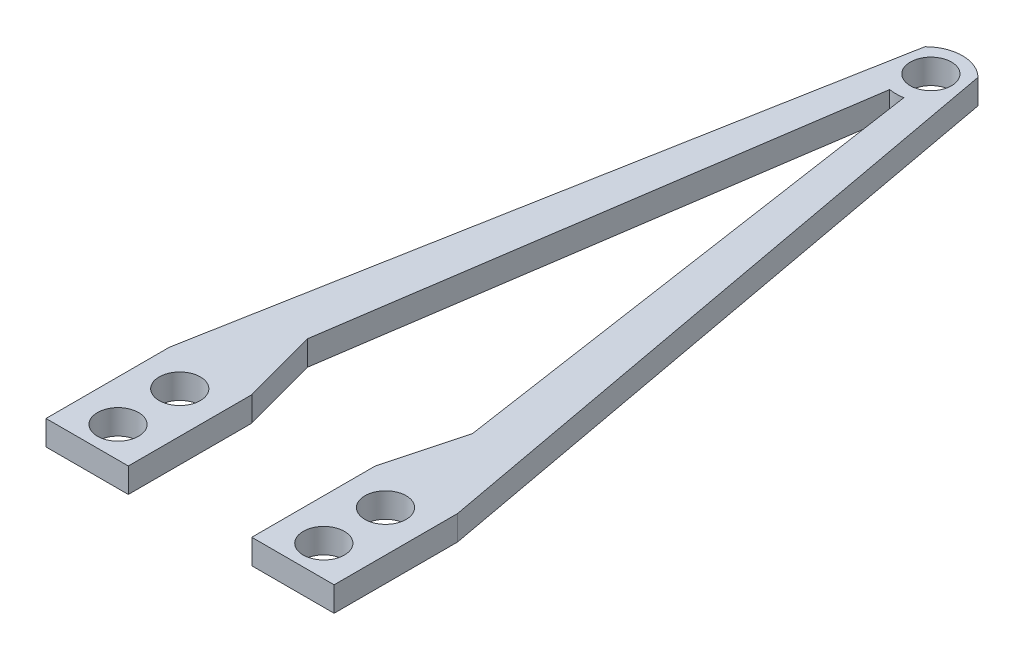
ISO-10303-21;
HEADER;
FILE_DESCRIPTION(('STEP AP214'),'2;1');
FILE_NAME('part.step','',(''),(''),'','','');
FILE_SCHEMA(('AUTOMOTIVE_DESIGN { 1 0 10303 214 1 1 1 1 }'));
ENDSEC;
DATA;
#1=APPLICATION_CONTEXT('core data for automotive mechanical design processes');
#2=APPLICATION_PROTOCOL_DEFINITION('international standard','automotive_design',2000,#1);
#3=PRODUCT_CONTEXT('',#1,'mechanical');
#4=PRODUCT('Part','Part','',(#3));
#5=PRODUCT_RELATED_PRODUCT_CATEGORY('part','',(#4));
#6=PRODUCT_DEFINITION_FORMATION('','',#4);
#7=PRODUCT_DEFINITION_CONTEXT('part definition',#1,'design');
#8=PRODUCT_DEFINITION('design','',#6,#7);
#9=PRODUCT_DEFINITION_SHAPE('','',#8);
#10=(LENGTH_UNIT() NAMED_UNIT(*) SI_UNIT(.MILLI.,.METRE.));
#11=(NAMED_UNIT(*) PLANE_ANGLE_UNIT() SI_UNIT($,.RADIAN.));
#12=(NAMED_UNIT(*) SI_UNIT($,.STERADIAN.) SOLID_ANGLE_UNIT());
#13=UNCERTAINTY_MEASURE_WITH_UNIT(LENGTH_MEASURE(1.E-05),#10,'distance_accuracy_value','');
#14=(GEOMETRIC_REPRESENTATION_CONTEXT(3) GLOBAL_UNCERTAINTY_ASSIGNED_CONTEXT((#13)) GLOBAL_UNIT_ASSIGNED_CONTEXT((#10,
#11,#12)) REPRESENTATION_CONTEXT('',''));
#15=CARTESIAN_POINT('',(0.,0.,0.));
#16=DIRECTION('',(0.,0.,1.));
#17=DIRECTION('',(1.,0.,0.));
#18=AXIS2_PLACEMENT_3D('',#15,#16,#17);
#19=CARTESIAN_POINT('',(-35.,6.,15.));
#20=DIRECTION('',(0.,0.,-1.));
#21=DIRECTION('',(-1.,0.,0.));
#22=AXIS2_PLACEMENT_3D('',#19,#20,#21);
#23=PLANE('',#22);
#24=DIRECTION('',(1.,0.,0.));
#25=VECTOR('',#24,1.);
#26=CARTESIAN_POINT('',(-35.,0.,15.));
#27=LINE('',#26,#25);
#28=CARTESIAN_POINT('',(-35.,0.,15.));
#29=VERTEX_POINT('',#28);
#30=CARTESIAN_POINT('',(-15.,0.,15.));
#31=VERTEX_POINT('',#30);
#32=EDGE_CURVE('E154',#29,#31,#27,.T.);
#33=ORIENTED_EDGE('',*,*,#32,.T.);
#34=DIRECTION('',(0.,1.,0.));
#35=VECTOR('',#34,1.);
#36=CARTESIAN_POINT('',(-15.,6.,15.));
#37=LINE('',#36,#35);
#38=CARTESIAN_POINT('',(-15.,6.,15.));
#39=VERTEX_POINT('',#38);
#40=EDGE_CURVE('E138',#31,#39,#37,.T.);
#41=ORIENTED_EDGE('',*,*,#40,.T.);
#42=DIRECTION('',(1.,0.,0.));
#43=VECTOR('',#42,1.);
#44=CARTESIAN_POINT('',(-35.,6.,15.));
#45=LINE('',#44,#43);
#46=CARTESIAN_POINT('',(-35.,6.,15.));
#47=VERTEX_POINT('',#46);
#48=EDGE_CURVE('E117',#47,#39,#45,.T.);
#49=ORIENTED_EDGE('',*,*,#48,.F.);
#50=DIRECTION('',(0.,-1.,0.));
#51=VECTOR('',#50,1.);
#52=CARTESIAN_POINT('',(-35.,6.,15.));
#53=LINE('',#52,#51);
#54=EDGE_CURVE('E126',#47,#29,#53,.T.);
#55=ORIENTED_EDGE('',*,*,#54,.T.);
#56=EDGE_LOOP('',(#33,#41,#49,#55));
#57=FACE_BOUND('',#56,.T.);
#58=ADVANCED_FACE('F40',(#57),#23,.F.);
#59=CARTESIAN_POINT('',(0.,6.,-163.552631578947));
#60=DIRECTION('',(0.,-1.,0.));
#61=DIRECTION('',(0.,0.,-1.));
#62=AXIS2_PLACEMENT_3D('',#59,#60,#61);
#63=PLANE('',#62);
#64=ORIENTED_EDGE('',*,*,#48,.T.);
#65=DIRECTION('',(0.,0.,1.));
#66=VECTOR('',#65,1.);
#67=CARTESIAN_POINT('',(-15.,6.,15.));
#68=LINE('',#67,#66);
#69=CARTESIAN_POINT('',(-15.,6.,-15.));
#70=VERTEX_POINT('',#69);
#71=EDGE_CURVE('E231',#70,#39,#68,.T.);
#72=ORIENTED_EDGE('',*,*,#71,.F.);
#73=DIRECTION('',(0.259665190265385,0.,0.965698705065116));
#74=VECTOR('',#73,1.);
#75=CARTESIAN_POINT('',(-15.,6.,-15.));
#76=LINE('',#75,#74);
#77=CARTESIAN_POINT('',(-20.,6.,-33.5950743740072));
#78=VERTEX_POINT('',#77);
#79=EDGE_CURVE('E520',#78,#70,#76,.T.);
#80=ORIENTED_EDGE('',*,*,#79,.F.);
#81=DIRECTION('',(-0.146873992605945,0.,0.989155210417449));
#82=VECTOR('',#81,1.);
#83=CARTESIAN_POINT('',(-20.,6.,-33.5950743740072));
#84=LINE('',#83,#82);
#85=CARTESIAN_POINT('',(-1.72181646251348,6.,-156.693521977177));
#86=VERTEX_POINT('',#85);
#87=EDGE_CURVE('E526',#86,#78,#84,.T.);
#88=ORIENTED_EDGE('',*,*,#87,.F.);
#89=CARTESIAN_POINT('',(0.,6.,-168.289473684211));
#90=DIRECTION('',(0.,-1.,0.));
#91=DIRECTION('',(0.,0.,1.));
#92=AXIS2_PLACEMENT_3D('',#89,#90,#91);
#93=CIRCLE('',#92,11.7230861091454);
#94=CARTESIAN_POINT('',(1.72181646251349,6.,-156.693521977177));
#95=VERTEX_POINT('',#94);
#96=EDGE_CURVE('E200',#95,#86,#93,.T.);
#97=ORIENTED_EDGE('',*,*,#96,.F.);
#98=DIRECTION('',(-0.146873992605945,0.,-0.989155210417449));
#99=VECTOR('',#98,1.);
#100=CARTESIAN_POINT('',(20.,6.,-33.5950743740072));
#101=LINE('',#100,#99);
#102=CARTESIAN_POINT('',(20.,6.,-33.5950743740072));
#103=VERTEX_POINT('',#102);
#104=EDGE_CURVE('E529',#103,#95,#101,.T.);
#105=ORIENTED_EDGE('',*,*,#104,.F.);
#106=DIRECTION('',(0.259665190265385,0.,-0.965698705065116));
#107=VECTOR('',#106,1.);
#108=CARTESIAN_POINT('',(15.,6.,-15.));
#109=LINE('',#108,#107);
#110=CARTESIAN_POINT('',(15.,6.,-15.));
#111=VERTEX_POINT('',#110);
#112=EDGE_CURVE('E226',#111,#103,#109,.T.);
#113=ORIENTED_EDGE('',*,*,#112,.F.);
#114=DIRECTION('',(0.,0.,-1.));
#115=VECTOR('',#114,1.);
#116=CARTESIAN_POINT('',(15.,6.,15.));
#117=LINE('',#116,#115);
#118=CARTESIAN_POINT('',(15.,6.,15.));
#119=VERTEX_POINT('',#118);
#120=EDGE_CURVE('E298',#119,#111,#117,.T.);
#121=ORIENTED_EDGE('',*,*,#120,.F.);
#122=CARTESIAN_POINT('',(35.,6.,15.));
#123=VERTEX_POINT('',#122);
#124=EDGE_CURVE('E123',#119,#123,#45,.T.);
#125=ORIENTED_EDGE('',*,*,#124,.T.);
#126=DIRECTION('',(0.,0.,-1.));
#127=VECTOR('',#126,1.);
#128=CARTESIAN_POINT('',(35.,6.,15.));
#129=LINE('',#128,#127);
#130=CARTESIAN_POINT('',(35.,6.,-15.));
#131=VERTEX_POINT('',#130);
#132=EDGE_CURVE('E64',#123,#131,#129,.T.);
#133=ORIENTED_EDGE('',*,*,#132,.T.);
#134=DIRECTION('',(-0.181162429476935,0.,-0.983453188589073));
#135=VECTOR('',#134,1.);
#136=CARTESIAN_POINT('',(6.44736842105264,6.,-170.));
#137=LINE('',#136,#135);
#138=CARTESIAN_POINT('',(6.44736842105264,6.,-170.));
#139=VERTEX_POINT('',#138);
#140=EDGE_CURVE('E157',#131,#139,#137,.T.);
#141=ORIENTED_EDGE('',*,*,#140,.T.);
#142=CARTESIAN_POINT('',(0.,6.,-163.552631578947));
#143=DIRECTION('',(0.,1.,0.));
#144=DIRECTION('',(0.,0.,-1.));
#145=AXIS2_PLACEMENT_3D('',#142,#143,#144);
#146=CIRCLE('',#145,9.11795586266869);
#147=CARTESIAN_POINT('',(-6.44736842105263,6.,-170.));
#148=VERTEX_POINT('',#147);
#149=EDGE_CURVE('E100',#139,#148,#146,.T.);
#150=ORIENTED_EDGE('',*,*,#149,.T.);
#151=DIRECTION('',(-0.181162429476935,0.,0.983453188589073));
#152=VECTOR('',#151,1.);
#153=CARTESIAN_POINT('',(-35.,6.,-15.));
#154=LINE('',#153,#152);
#155=CARTESIAN_POINT('',(-35.,6.,-15.));
#156=VERTEX_POINT('',#155);
#157=EDGE_CURVE('E119',#148,#156,#154,.T.);
#158=ORIENTED_EDGE('',*,*,#157,.T.);
#159=DIRECTION('',(0.,0.,1.));
#160=VECTOR('',#159,1.);
#161=CARTESIAN_POINT('',(-35.,6.,15.));
#162=LINE('',#161,#160);
#163=EDGE_CURVE('E110',#156,#47,#162,.T.);
#164=ORIENTED_EDGE('',*,*,#163,.T.);
#165=EDGE_LOOP('',(#64,#72,#80,#88,#97,#105,#113,#121,#125,#133,#141,#150,#158,#164));
#166=FACE_BOUND('',#165,.T.);
#167=CARTESIAN_POINT('',(0.,6.,-165.));
#168=DIRECTION('',(0.,1.,0.));
#169=DIRECTION('',(0.,0.,1.));
#170=AXIS2_PLACEMENT_3D('',#167,#168,#169);
#171=CIRCLE('',#170,5.);
#172=CARTESIAN_POINT('',(0.,6.,-160.));
#173=VERTEX_POINT('',#172);
#174=EDGE_CURVE('E148',#173,#173,#171,.T.);
#175=ORIENTED_EDGE('',*,*,#174,.F.);
#176=EDGE_LOOP('',(#175));
#177=FACE_BOUND('',#176,.T.);
#178=CARTESIAN_POINT('',(-25.,6.,-7.5));
#179=DIRECTION('',(0.,1.,0.));
#180=DIRECTION('',(0.,0.,1.));
#181=AXIS2_PLACEMENT_3D('',#178,#179,#180);
#182=CIRCLE('',#181,5.);
#183=CARTESIAN_POINT('',(-25.,6.,-2.5));
#184=VERTEX_POINT('',#183);
#185=EDGE_CURVE('E258',#184,#184,#182,.T.);
#186=ORIENTED_EDGE('',*,*,#185,.F.);
#187=EDGE_LOOP('',(#186));
#188=FACE_BOUND('',#187,.T.);
#189=CARTESIAN_POINT('',(25.,6.,-7.5));
#190=DIRECTION('',(0.,1.,0.));
#191=DIRECTION('',(0.,0.,-1.));
#192=AXIS2_PLACEMENT_3D('',#189,#190,#191);
#193=CIRCLE('',#192,5.);
#194=CARTESIAN_POINT('',(25.,6.,-12.5));
#195=VERTEX_POINT('',#194);
#196=EDGE_CURVE('E252',#195,#195,#193,.T.);
#197=ORIENTED_EDGE('',*,*,#196,.F.);
#198=EDGE_LOOP('',(#197));
#199=FACE_BOUND('',#198,.T.);
#200=CARTESIAN_POINT('',(-25.,6.,7.5));
#201=DIRECTION('',(0.,1.,0.));
#202=DIRECTION('',(0.,0.,1.));
#203=AXIS2_PLACEMENT_3D('',#200,#201,#202);
#204=CIRCLE('',#203,5.);
#205=CARTESIAN_POINT('',(-25.,6.,12.5));
#206=VERTEX_POINT('',#205);
#207=EDGE_CURVE('E246',#206,#206,#204,.T.);
#208=ORIENTED_EDGE('',*,*,#207,.F.);
#209=EDGE_LOOP('',(#208));
#210=FACE_BOUND('',#209,.T.);
#211=CARTESIAN_POINT('',(25.,6.,7.5));
#212=DIRECTION('',(0.,1.,0.));
#213=DIRECTION('',(0.,0.,-1.));
#214=AXIS2_PLACEMENT_3D('',#211,#212,#213);
#215=CIRCLE('',#214,5.);
#216=CARTESIAN_POINT('',(25.,6.,2.5));
#217=VERTEX_POINT('',#216);
#218=EDGE_CURVE('E240',#217,#217,#215,.T.);
#219=ORIENTED_EDGE('',*,*,#218,.F.);
#220=EDGE_LOOP('',(#219));
#221=FACE_BOUND('',#220,.T.);
#222=ADVANCED_FACE('F112',(#166,#177,#188,#199,#210,#221),#63,.F.);
#223=CARTESIAN_POINT('',(0.,0.,-163.552631578947));
#224=DIRECTION('',(0.,-1.,0.));
#225=DIRECTION('',(0.,0.,-1.));
#226=AXIS2_PLACEMENT_3D('',#223,#224,#225);
#227=PLANE('',#226);
#228=DIRECTION('',(0.,0.,-1.));
#229=VECTOR('',#228,1.);
#230=CARTESIAN_POINT('',(-15.,0.,-163.552631578947));
#231=LINE('',#230,#229);
#232=CARTESIAN_POINT('',(-15.,0.,-15.));
#233=VERTEX_POINT('',#232);
#234=EDGE_CURVE('E235',#31,#233,#231,.T.);
#235=ORIENTED_EDGE('',*,*,#234,.F.);
#236=ORIENTED_EDGE('',*,*,#32,.F.);
#237=DIRECTION('',(0.,0.,1.));
#238=VECTOR('',#237,1.);
#239=CARTESIAN_POINT('',(-35.,0.,15.));
#240=LINE('',#239,#238);
#241=CARTESIAN_POINT('',(-35.,0.,-15.));
#242=VERTEX_POINT('',#241);
#243=EDGE_CURVE('E129',#242,#29,#240,.T.);
#244=ORIENTED_EDGE('',*,*,#243,.F.);
#245=DIRECTION('',(-0.181162429476935,0.,0.983453188589073));
#246=VECTOR('',#245,1.);
#247=CARTESIAN_POINT('',(-35.,0.,-15.));
#248=LINE('',#247,#246);
#249=CARTESIAN_POINT('',(-6.44736842105263,0.,-170.));
#250=VERTEX_POINT('',#249);
#251=EDGE_CURVE('E150',#250,#242,#248,.T.);
#252=ORIENTED_EDGE('',*,*,#251,.F.);
#253=CARTESIAN_POINT('',(0.,0.,-163.552631578947));
#254=DIRECTION('',(0.,1.,0.));
#255=DIRECTION('',(0.,0.,-1.));
#256=AXIS2_PLACEMENT_3D('',#253,#254,#255);
#257=CIRCLE('',#256,9.11795586266869);
#258=CARTESIAN_POINT('',(6.44736842105264,0.,-170.));
#259=VERTEX_POINT('',#258);
#260=EDGE_CURVE('E147',#259,#250,#257,.T.);
#261=ORIENTED_EDGE('',*,*,#260,.F.);
#262=DIRECTION('',(-0.181162429476935,0.,-0.983453188589073));
#263=VECTOR('',#262,1.);
#264=CARTESIAN_POINT('',(6.44736842105264,0.,-170.));
#265=LINE('',#264,#263);
#266=CARTESIAN_POINT('',(35.,0.,-15.));
#267=VERTEX_POINT('',#266);
#268=EDGE_CURVE('E144',#267,#259,#265,.T.);
#269=ORIENTED_EDGE('',*,*,#268,.F.);
#270=DIRECTION('',(0.,0.,-1.));
#271=VECTOR('',#270,1.);
#272=CARTESIAN_POINT('',(35.,0.,15.));
#273=LINE('',#272,#271);
#274=CARTESIAN_POINT('',(35.,0.,15.));
#275=VERTEX_POINT('',#274);
#276=EDGE_CURVE('E91',#275,#267,#273,.T.);
#277=ORIENTED_EDGE('',*,*,#276,.F.);
#278=CARTESIAN_POINT('',(15.,0.,15.));
#279=VERTEX_POINT('',#278);
#280=EDGE_CURVE('E153',#279,#275,#27,.T.);
#281=ORIENTED_EDGE('',*,*,#280,.F.);
#282=DIRECTION('',(0.,0.,1.));
#283=VECTOR('',#282,1.);
#284=CARTESIAN_POINT('',(15.,0.,-163.552631578947));
#285=LINE('',#284,#283);
#286=CARTESIAN_POINT('',(15.,0.,-15.));
#287=VERTEX_POINT('',#286);
#288=EDGE_CURVE('E55',#287,#279,#285,.T.);
#289=ORIENTED_EDGE('',*,*,#288,.F.);
#290=DIRECTION('',(-0.259665190265385,0.,0.965698705065116));
#291=VECTOR('',#290,1.);
#292=CARTESIAN_POINT('',(51.23942083321,0.,-149.774945132897));
#293=LINE('',#292,#291);
#294=CARTESIAN_POINT('',(20.,0.,-33.5950743740072));
#295=VERTEX_POINT('',#294);
#296=EDGE_CURVE('E169',#295,#287,#293,.T.);
#297=ORIENTED_EDGE('',*,*,#296,.F.);
#298=DIRECTION('',(0.146873992605945,0.,0.989155210417449));
#299=VECTOR('',#298,1.);
#300=CARTESIAN_POINT('',(0.688173987130995,0.,-163.654814593335));
#301=LINE('',#300,#299);
#302=CARTESIAN_POINT('',(1.72181646251349,0.,-156.693521977177));
#303=VERTEX_POINT('',#302);
#304=EDGE_CURVE('E172',#303,#295,#301,.T.);
#305=ORIENTED_EDGE('',*,*,#304,.F.);
#306=CARTESIAN_POINT('',(0.,0.,-168.289473684211));
#307=DIRECTION('',(0.,-1.,0.));
#308=DIRECTION('',(0.,0.,-1.));
#309=AXIS2_PLACEMENT_3D('',#306,#307,#308);
#310=CIRCLE('',#309,11.7230861091454);
#311=CARTESIAN_POINT('',(-1.72181646251348,0.,-156.693521977177));
#312=VERTEX_POINT('',#311);
#313=EDGE_CURVE('E175',#312,#303,#310,.F.);
#314=ORIENTED_EDGE('',*,*,#313,.F.);
#315=DIRECTION('',(0.146873992605945,0.,-0.989155210417449));
#316=VECTOR('',#315,1.);
#317=CARTESIAN_POINT('',(-0.688173987130991,0.,-163.654814593335));
#318=LINE('',#317,#316);
#319=CARTESIAN_POINT('',(-20.,0.,-33.5950743740072));
#320=VERTEX_POINT('',#319);
#321=EDGE_CURVE('E48',#320,#312,#318,.T.);
#322=ORIENTED_EDGE('',*,*,#321,.F.);
#323=DIRECTION('',(-0.259665190265385,0.,-0.965698705065116));
#324=VECTOR('',#323,1.);
#325=CARTESIAN_POINT('',(-51.23942083321,0.,-149.774945132897));
#326=LINE('',#325,#324);
#327=EDGE_CURVE('E11',#233,#320,#326,.T.);
#328=ORIENTED_EDGE('',*,*,#327,.F.);
#329=EDGE_LOOP('',(#235,#236,#244,#252,#261,#269,#277,#281,#289,#297,#305,#314,#322,#328));
#330=FACE_BOUND('',#329,.T.);
#331=CARTESIAN_POINT('',(-25.,0.,7.5));
#332=DIRECTION('',(0.,1.,0.));
#333=DIRECTION('',(0.,0.,1.));
#334=AXIS2_PLACEMENT_3D('',#331,#332,#333);
#335=CIRCLE('',#334,5.);
#336=CARTESIAN_POINT('',(-25.,0.,12.5));
#337=VERTEX_POINT('',#336);
#338=EDGE_CURVE('E243',#337,#337,#335,.T.);
#339=ORIENTED_EDGE('',*,*,#338,.T.);
#340=EDGE_LOOP('',(#339));
#341=FACE_BOUND('',#340,.T.);
#342=CARTESIAN_POINT('',(-25.,0.,-7.5));
#343=DIRECTION('',(0.,1.,0.));
#344=DIRECTION('',(0.,0.,1.));
#345=AXIS2_PLACEMENT_3D('',#342,#343,#344);
#346=CIRCLE('',#345,5.);
#347=CARTESIAN_POINT('',(-25.,0.,-2.5));
#348=VERTEX_POINT('',#347);
#349=EDGE_CURVE('E255',#348,#348,#346,.T.);
#350=ORIENTED_EDGE('',*,*,#349,.T.);
#351=EDGE_LOOP('',(#350));
#352=FACE_BOUND('',#351,.T.);
#353=CARTESIAN_POINT('',(0.,0.,-165.));
#354=DIRECTION('',(0.,1.,0.));
#355=DIRECTION('',(0.,0.,1.));
#356=AXIS2_PLACEMENT_3D('',#353,#354,#355);
#357=CIRCLE('',#356,5.);
#358=CARTESIAN_POINT('',(0.,0.,-160.));
#359=VERTEX_POINT('',#358);
#360=EDGE_CURVE('E261',#359,#359,#357,.T.);
#361=ORIENTED_EDGE('',*,*,#360,.T.);
#362=EDGE_LOOP('',(#361));
#363=FACE_BOUND('',#362,.T.);
#364=CARTESIAN_POINT('',(25.,0.,-7.5));
#365=DIRECTION('',(0.,1.,0.));
#366=DIRECTION('',(0.,0.,-1.));
#367=AXIS2_PLACEMENT_3D('',#364,#365,#366);
#368=CIRCLE('',#367,5.);
#369=CARTESIAN_POINT('',(25.,0.,-12.5));
#370=VERTEX_POINT('',#369);
#371=EDGE_CURVE('E249',#370,#370,#368,.T.);
#372=ORIENTED_EDGE('',*,*,#371,.T.);
#373=EDGE_LOOP('',(#372));
#374=FACE_BOUND('',#373,.T.);
#375=CARTESIAN_POINT('',(25.,0.,7.5));
#376=DIRECTION('',(0.,1.,0.));
#377=DIRECTION('',(0.,0.,-1.));
#378=AXIS2_PLACEMENT_3D('',#375,#376,#377);
#379=CIRCLE('',#378,5.);
#380=CARTESIAN_POINT('',(25.,0.,2.5));
#381=VERTEX_POINT('',#380);
#382=EDGE_CURVE('E239',#381,#381,#379,.T.);
#383=ORIENTED_EDGE('',*,*,#382,.T.);
#384=EDGE_LOOP('',(#383));
#385=FACE_BOUND('',#384,.T.);
#386=ADVANCED_FACE('F206',(#330,#341,#352,#363,#374,#385),#227,.T.);
#387=CARTESIAN_POINT('',(6.44736842105264,6.,-170.));
#388=DIRECTION('',(-0.983453188589073,0.,0.181162429476935));
#389=DIRECTION('',(0.181162429476935,0.,0.983453188589073));
#390=AXIS2_PLACEMENT_3D('',#387,#388,#389);
#391=PLANE('',#390);
#392=ORIENTED_EDGE('',*,*,#268,.T.);
#393=DIRECTION('',(0.,-1.,0.));
#394=VECTOR('',#393,1.);
#395=CARTESIAN_POINT('',(6.44736842105264,6.,-170.));
#396=LINE('',#395,#394);
#397=EDGE_CURVE('E164',#139,#259,#396,.T.);
#398=ORIENTED_EDGE('',*,*,#397,.F.);
#399=ORIENTED_EDGE('',*,*,#140,.F.);
#400=DIRECTION('',(0.,-1.,0.));
#401=VECTOR('',#400,1.);
#402=CARTESIAN_POINT('',(35.,6.,-15.));
#403=LINE('',#402,#401);
#404=EDGE_CURVE('E140',#131,#267,#403,.T.);
#405=ORIENTED_EDGE('',*,*,#404,.T.);
#406=EDGE_LOOP('',(#392,#398,#399,#405));
#407=FACE_BOUND('',#406,.T.);
#408=ADVANCED_FACE('F42',(#407),#391,.F.);
#409=CARTESIAN_POINT('',(0.,6.,-163.552631578947));
#410=DIRECTION('',(0.,-1.,0.));
#411=DIRECTION('',(0.,0.,-1.));
#412=AXIS2_PLACEMENT_3D('',#409,#410,#411);
#413=CYLINDRICAL_SURFACE('',#412,9.11795586266869);
#414=ORIENTED_EDGE('',*,*,#260,.T.);
#415=DIRECTION('',(0.,-1.,0.));
#416=VECTOR('',#415,1.);
#417=CARTESIAN_POINT('',(-6.44736842105263,6.,-170.));
#418=LINE('',#417,#416);
#419=EDGE_CURVE('E161',#148,#250,#418,.T.);
#420=ORIENTED_EDGE('',*,*,#419,.F.);
#421=ORIENTED_EDGE('',*,*,#149,.F.);
#422=ORIENTED_EDGE('',*,*,#397,.T.);
#423=EDGE_LOOP('',(#414,#420,#421,#422));
#424=FACE_BOUND('',#423,.T.);
#425=ADVANCED_FACE('F271',(#424),#413,.T.);
#426=CARTESIAN_POINT('',(-35.,6.,-15.));
#427=DIRECTION('',(0.983453188589073,0.,0.181162429476935));
#428=DIRECTION('',(0.181162429476935,0.,-0.983453188589073));
#429=AXIS2_PLACEMENT_3D('',#426,#427,#428);
#430=PLANE('',#429);
#431=ORIENTED_EDGE('',*,*,#251,.T.);
#432=DIRECTION('',(0.,-1.,0.));
#433=VECTOR('',#432,1.);
#434=CARTESIAN_POINT('',(-35.,6.,-15.));
#435=LINE('',#434,#433);
#436=EDGE_CURVE('E133',#156,#242,#435,.T.);
#437=ORIENTED_EDGE('',*,*,#436,.F.);
#438=ORIENTED_EDGE('',*,*,#157,.F.);
#439=ORIENTED_EDGE('',*,*,#419,.T.);
#440=EDGE_LOOP('',(#431,#437,#438,#439));
#441=FACE_BOUND('',#440,.T.);
#442=ADVANCED_FACE('F274',(#441),#430,.F.);
#443=CARTESIAN_POINT('',(-35.,6.,15.));
#444=DIRECTION('',(1.,0.,0.));
#445=DIRECTION('',(0.,0.,-1.));
#446=AXIS2_PLACEMENT_3D('',#443,#444,#445);
#447=PLANE('',#446);
#448=ORIENTED_EDGE('',*,*,#243,.T.);
#449=ORIENTED_EDGE('',*,*,#54,.F.);
#450=ORIENTED_EDGE('',*,*,#163,.F.);
#451=ORIENTED_EDGE('',*,*,#436,.T.);
#452=EDGE_LOOP('',(#448,#449,#450,#451));
#453=FACE_BOUND('',#452,.T.);
#454=ADVANCED_FACE('F127',(#453),#447,.F.);
#455=ORIENTED_EDGE('',*,*,#124,.F.);
#456=DIRECTION('',(0.,-1.,0.));
#457=VECTOR('',#456,1.);
#458=CARTESIAN_POINT('',(15.,6.,15.));
#459=LINE('',#458,#457);
#460=EDGE_CURVE('E166',#119,#279,#459,.T.);
#461=ORIENTED_EDGE('',*,*,#460,.T.);
#462=ORIENTED_EDGE('',*,*,#280,.T.);
#463=DIRECTION('',(0.,-1.,0.));
#464=VECTOR('',#463,1.);
#465=CARTESIAN_POINT('',(35.,6.,15.));
#466=LINE('',#465,#464);
#467=EDGE_CURVE('E134',#123,#275,#466,.T.);
#468=ORIENTED_EDGE('',*,*,#467,.F.);
#469=EDGE_LOOP('',(#455,#461,#462,#468));
#470=FACE_BOUND('',#469,.T.);
#471=ADVANCED_FACE('F304',(#470),#23,.F.);
#472=CARTESIAN_POINT('',(35.,6.,15.));
#473=DIRECTION('',(-1.,0.,0.));
#474=DIRECTION('',(0.,0.,1.));
#475=AXIS2_PLACEMENT_3D('',#472,#473,#474);
#476=PLANE('',#475);
#477=ORIENTED_EDGE('',*,*,#276,.T.);
#478=ORIENTED_EDGE('',*,*,#404,.F.);
#479=ORIENTED_EDGE('',*,*,#132,.F.);
#480=ORIENTED_EDGE('',*,*,#467,.T.);
#481=EDGE_LOOP('',(#477,#478,#479,#480));
#482=FACE_BOUND('',#481,.T.);
#483=ADVANCED_FACE('F305',(#482),#476,.F.);
#484=CARTESIAN_POINT('',(0.,6.,-165.));
#485=DIRECTION('',(0.,-1.,0.));
#486=DIRECTION('',(0.,0.,-1.));
#487=AXIS2_PLACEMENT_3D('',#484,#485,#486);
#488=CYLINDRICAL_SURFACE('',#487,5.);
#489=ORIENTED_EDGE('',*,*,#174,.T.);
#490=EDGE_LOOP('',(#489));
#491=FACE_BOUND('',#490,.T.);
#492=ORIENTED_EDGE('',*,*,#360,.F.);
#493=EDGE_LOOP('',(#492));
#494=FACE_BOUND('',#493,.T.);
#495=ADVANCED_FACE('F327',(#491,#494),#488,.F.);
#496=CARTESIAN_POINT('',(-25.,6.,-7.5));
#497=DIRECTION('',(0.,-1.,0.));
#498=DIRECTION('',(0.,0.,-1.));
#499=AXIS2_PLACEMENT_3D('',#496,#497,#498);
#500=CYLINDRICAL_SURFACE('',#499,5.);
#501=ORIENTED_EDGE('',*,*,#185,.T.);
#502=EDGE_LOOP('',(#501));
#503=FACE_BOUND('',#502,.T.);
#504=ORIENTED_EDGE('',*,*,#349,.F.);
#505=EDGE_LOOP('',(#504));
#506=FACE_BOUND('',#505,.T.);
#507=ADVANCED_FACE('F399',(#503,#506),#500,.F.);
#508=CARTESIAN_POINT('',(25.,6.,-7.5));
#509=DIRECTION('',(0.,-1.,0.));
#510=DIRECTION('',(0.,0.,-1.));
#511=AXIS2_PLACEMENT_3D('',#508,#509,#510);
#512=CYLINDRICAL_SURFACE('',#511,5.);
#513=ORIENTED_EDGE('',*,*,#196,.T.);
#514=EDGE_LOOP('',(#513));
#515=FACE_BOUND('',#514,.T.);
#516=ORIENTED_EDGE('',*,*,#371,.F.);
#517=EDGE_LOOP('',(#516));
#518=FACE_BOUND('',#517,.T.);
#519=ADVANCED_FACE('F388',(#515,#518),#512,.F.);
#520=CARTESIAN_POINT('',(-25.,6.,7.5));
#521=DIRECTION('',(0.,-1.,0.));
#522=DIRECTION('',(0.,0.,-1.));
#523=AXIS2_PLACEMENT_3D('',#520,#521,#522);
#524=CYLINDRICAL_SURFACE('',#523,5.);
#525=ORIENTED_EDGE('',*,*,#207,.T.);
#526=EDGE_LOOP('',(#525));
#527=FACE_BOUND('',#526,.T.);
#528=ORIENTED_EDGE('',*,*,#338,.F.);
#529=EDGE_LOOP('',(#528));
#530=FACE_BOUND('',#529,.T.);
#531=ADVANCED_FACE('F377',(#527,#530),#524,.F.);
#532=CARTESIAN_POINT('',(25.,6.,7.5));
#533=DIRECTION('',(0.,-1.,0.));
#534=DIRECTION('',(0.,0.,-1.));
#535=AXIS2_PLACEMENT_3D('',#532,#533,#534);
#536=CYLINDRICAL_SURFACE('',#535,5.);
#537=ORIENTED_EDGE('',*,*,#218,.T.);
#538=EDGE_LOOP('',(#537));
#539=FACE_BOUND('',#538,.T.);
#540=ORIENTED_EDGE('',*,*,#382,.F.);
#541=EDGE_LOOP('',(#540));
#542=FACE_BOUND('',#541,.T.);
#543=ADVANCED_FACE('F371',(#539,#542),#536,.F.);
#544=CARTESIAN_POINT('',(-15.,-4.,15.));
#545=DIRECTION('',(-1.,0.,0.));
#546=DIRECTION('',(0.,0.,1.));
#547=AXIS2_PLACEMENT_3D('',#544,#545,#546);
#548=PLANE('',#547);
#549=ORIENTED_EDGE('',*,*,#234,.T.);
#550=DIRECTION('',(0.,1.,0.));
#551=VECTOR('',#550,1.);
#552=CARTESIAN_POINT('',(-15.,-4.,-15.));
#553=LINE('',#552,#551);
#554=EDGE_CURVE('E236',#233,#70,#553,.T.);
#555=ORIENTED_EDGE('',*,*,#554,.T.);
#556=ORIENTED_EDGE('',*,*,#71,.T.);
#557=ORIENTED_EDGE('',*,*,#40,.F.);
#558=EDGE_LOOP('',(#549,#555,#556,#557));
#559=FACE_BOUND('',#558,.T.);
#560=ADVANCED_FACE('F376',(#559),#548,.F.);
#561=CARTESIAN_POINT('',(-15.,-4.,-15.));
#562=DIRECTION('',(-0.965698705065116,0.,0.259665190265385));
#563=DIRECTION('',(0.259665190265385,0.,0.965698705065116));
#564=AXIS2_PLACEMENT_3D('',#561,#562,#563);
#565=PLANE('',#564);
#566=ORIENTED_EDGE('',*,*,#327,.T.);
#567=DIRECTION('',(0.,1.,0.));
#568=VECTOR('',#567,1.);
#569=CARTESIAN_POINT('',(-20.,-4.,-33.5950743740072));
#570=LINE('',#569,#568);
#571=EDGE_CURVE('E190',#320,#78,#570,.T.);
#572=ORIENTED_EDGE('',*,*,#571,.T.);
#573=ORIENTED_EDGE('',*,*,#79,.T.);
#574=ORIENTED_EDGE('',*,*,#554,.F.);
#575=EDGE_LOOP('',(#566,#572,#573,#574));
#576=FACE_BOUND('',#575,.T.);
#577=ADVANCED_FACE('F451',(#576),#565,.F.);
#578=CARTESIAN_POINT('',(-20.,-4.,-33.5950743740072));
#579=DIRECTION('',(-0.989155210417449,0.,-0.146873992605945));
#580=DIRECTION('',(-0.146873992605945,0.,0.989155210417449));
#581=AXIS2_PLACEMENT_3D('',#578,#579,#580);
#582=PLANE('',#581);
#583=ORIENTED_EDGE('',*,*,#321,.T.);
#584=DIRECTION('',(0.,1.,0.));
#585=VECTOR('',#584,1.);
#586=CARTESIAN_POINT('',(-1.72181646251348,-4.,-156.693521977177));
#587=LINE('',#586,#585);
#588=EDGE_CURVE('E187',#312,#86,#587,.T.);
#589=ORIENTED_EDGE('',*,*,#588,.T.);
#590=ORIENTED_EDGE('',*,*,#87,.T.);
#591=ORIENTED_EDGE('',*,*,#571,.F.);
#592=EDGE_LOOP('',(#583,#589,#590,#591));
#593=FACE_BOUND('',#592,.T.);
#594=ADVANCED_FACE('F184',(#593),#582,.F.);
#595=CARTESIAN_POINT('',(0.,-4.,-168.289473684211));
#596=DIRECTION('',(0.,1.,0.));
#597=DIRECTION('',(0.,0.,1.));
#598=AXIS2_PLACEMENT_3D('',#595,#596,#597);
#599=CYLINDRICAL_SURFACE('',#598,11.7230861091454);
#600=ORIENTED_EDGE('',*,*,#313,.T.);
#601=DIRECTION('',(0.,1.,0.));
#602=VECTOR('',#601,1.);
#603=CARTESIAN_POINT('',(1.72181646251349,-4.,-156.693521977177));
#604=LINE('',#603,#602);
#605=EDGE_CURVE('E202',#303,#95,#604,.T.);
#606=ORIENTED_EDGE('',*,*,#605,.T.);
#607=ORIENTED_EDGE('',*,*,#96,.T.);
#608=ORIENTED_EDGE('',*,*,#588,.F.);
#609=EDGE_LOOP('',(#600,#606,#607,#608));
#610=FACE_BOUND('',#609,.T.);
#611=ADVANCED_FACE('F196',(#610),#599,.T.);
#612=CARTESIAN_POINT('',(20.,-4.,-33.5950743740072));
#613=DIRECTION('',(0.989155210417449,0.,-0.146873992605945));
#614=DIRECTION('',(-0.146873992605945,0.,-0.989155210417449));
#615=AXIS2_PLACEMENT_3D('',#612,#613,#614);
#616=PLANE('',#615);
#617=ORIENTED_EDGE('',*,*,#304,.T.);
#618=DIRECTION('',(0.,1.,0.));
#619=VECTOR('',#618,1.);
#620=CARTESIAN_POINT('',(20.,-4.,-33.5950743740072));
#621=LINE('',#620,#619);
#622=EDGE_CURVE('E217',#295,#103,#621,.T.);
#623=ORIENTED_EDGE('',*,*,#622,.T.);
#624=ORIENTED_EDGE('',*,*,#104,.T.);
#625=ORIENTED_EDGE('',*,*,#605,.F.);
#626=EDGE_LOOP('',(#617,#623,#624,#625));
#627=FACE_BOUND('',#626,.T.);
#628=ADVANCED_FACE('F214',(#627),#616,.F.);
#629=CARTESIAN_POINT('',(15.,-4.,-15.));
#630=DIRECTION('',(0.965698705065116,0.,0.259665190265385));
#631=DIRECTION('',(0.259665190265385,0.,-0.965698705065116));
#632=AXIS2_PLACEMENT_3D('',#629,#630,#631);
#633=PLANE('',#632);
#634=ORIENTED_EDGE('',*,*,#296,.T.);
#635=DIRECTION('',(0.,1.,0.));
#636=VECTOR('',#635,1.);
#637=CARTESIAN_POINT('',(15.,-4.,-15.));
#638=LINE('',#637,#636);
#639=EDGE_CURVE('E228',#287,#111,#638,.T.);
#640=ORIENTED_EDGE('',*,*,#639,.T.);
#641=ORIENTED_EDGE('',*,*,#112,.T.);
#642=ORIENTED_EDGE('',*,*,#622,.F.);
#643=EDGE_LOOP('',(#634,#640,#641,#642));
#644=FACE_BOUND('',#643,.T.);
#645=ADVANCED_FACE('F222',(#644),#633,.F.);
#646=CARTESIAN_POINT('',(15.,-4.,15.));
#647=DIRECTION('',(1.,0.,0.));
#648=DIRECTION('',(0.,0.,-1.));
#649=AXIS2_PLACEMENT_3D('',#646,#647,#648);
#650=PLANE('',#649);
#651=ORIENTED_EDGE('',*,*,#288,.T.);
#652=ORIENTED_EDGE('',*,*,#460,.F.);
#653=ORIENTED_EDGE('',*,*,#120,.T.);
#654=ORIENTED_EDGE('',*,*,#639,.F.);
#655=EDGE_LOOP('',(#651,#652,#653,#654));
#656=FACE_BOUND('',#655,.T.);
#657=ADVANCED_FACE('F297',(#656),#650,.F.);
#658=CLOSED_SHELL('',(#58,#222,#386,#408,#425,#442,#454,#471,#483,#495,#507,#519,#531,#543,#560,
#577,#594,#611,#628,#645,#657));
#659=MANIFOLD_SOLID_BREP('B2',#658);
#660=ADVANCED_BREP_SHAPE_REPRESENTATION('',(#18,#659),#14);
#661=SHAPE_DEFINITION_REPRESENTATION(#9,#660);
ENDSEC;
END-ISO-10303-21;
